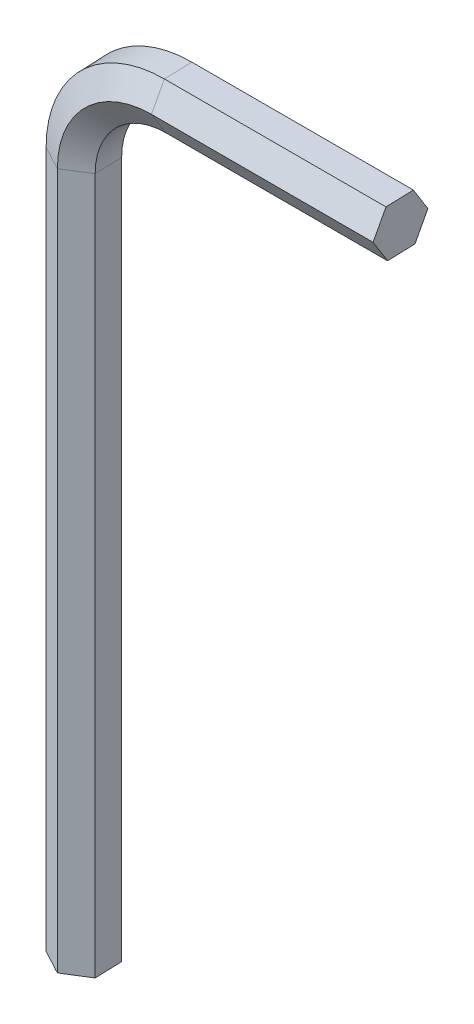
ISO-10303-21;
HEADER;
FILE_DESCRIPTION(('STEP AP214'),'2;1');
FILE_NAME('part.step','',(''),(''),'','','');
FILE_SCHEMA(('AUTOMOTIVE_DESIGN { 1 0 10303 214 1 1 1 1 }'));
ENDSEC;
DATA;
#1=APPLICATION_CONTEXT('core data for automotive mechanical design processes');
#2=APPLICATION_PROTOCOL_DEFINITION('international standard','automotive_design',2000,#1);
#3=PRODUCT_CONTEXT('',#1,'mechanical');
#4=PRODUCT('Part','Part','',(#3));
#5=PRODUCT_RELATED_PRODUCT_CATEGORY('part','',(#4));
#6=PRODUCT_DEFINITION_FORMATION('','',#4);
#7=PRODUCT_DEFINITION_CONTEXT('part definition',#1,'design');
#8=PRODUCT_DEFINITION('design','',#6,#7);
#9=PRODUCT_DEFINITION_SHAPE('','',#8);
#10=(LENGTH_UNIT() NAMED_UNIT(*) SI_UNIT(.MILLI.,.METRE.));
#11=(NAMED_UNIT(*) PLANE_ANGLE_UNIT() SI_UNIT($,.RADIAN.));
#12=(NAMED_UNIT(*) SI_UNIT($,.STERADIAN.) SOLID_ANGLE_UNIT());
#13=UNCERTAINTY_MEASURE_WITH_UNIT(LENGTH_MEASURE(1.E-05),#10,'distance_accuracy_value','');
#14=(GEOMETRIC_REPRESENTATION_CONTEXT(3) GLOBAL_UNCERTAINTY_ASSIGNED_CONTEXT((#13)) GLOBAL_UNIT_ASSIGNED_CONTEXT((#10,
#11,#12)) REPRESENTATION_CONTEXT('',''));
#15=CARTESIAN_POINT('',(0.,0.,0.));
#16=DIRECTION('',(0.,0.,1.));
#17=DIRECTION('',(1.,0.,0.));
#18=AXIS2_PLACEMENT_3D('',#15,#16,#17);
#19=CARTESIAN_POINT('',(0.,0.,0.));
#20=DIRECTION('',(0.,1.,0.));
#21=DIRECTION('',(0.,0.,1.));
#22=AXIS2_PLACEMENT_3D('',#19,#20,#21);
#23=PLANE('',#22);
#24=DIRECTION('',(-0.0329884243082686,0.,-0.99945573381799));
#25=VECTOR('',#24,1.);
#26=CARTESIAN_POINT('',(1.94024556604513,0.,1.03641070210713));
#27=LINE('',#26,#25);
#28=CARTESIAN_POINT('',(1.94024556604513,0.,1.03641070210713));
#29=VERTEX_POINT('',#28);
#30=CARTESIAN_POINT('',(1.86768077980141,0.,-1.16209659872164));
#31=VERTEX_POINT('',#30);
#32=EDGE_CURVE('E188',#29,#31,#27,.T.);
#33=ORIENTED_EDGE('',*,*,#32,.F.);
#34=DIRECTION('',(0.849059843290263,0.,-0.528296680390776));
#35=VECTOR('',#34,1.);
#36=CARTESIAN_POINT('',(0.0725647862437208,0.,2.19850730082877));
#37=LINE('',#36,#35);
#38=CARTESIAN_POINT('',(0.0725647862437208,0.,2.19850730082877));
#39=VERTEX_POINT('',#38);
#40=EDGE_CURVE('E230',#39,#29,#37,.T.);
#41=ORIENTED_EDGE('',*,*,#40,.F.);
#42=DIRECTION('',(0.882048267598532,0.,0.471159053427215));
#43=VECTOR('',#42,1.);
#44=CARTESIAN_POINT('',(-1.86768077980141,0.,1.16209659872164));
#45=LINE('',#44,#43);
#46=CARTESIAN_POINT('',(-1.86768077980141,0.,1.16209659872164));
#47=VERTEX_POINT('',#46);
#48=EDGE_CURVE('E217',#47,#39,#45,.T.);
#49=ORIENTED_EDGE('',*,*,#48,.F.);
#50=DIRECTION('',(0.0329884243082689,0.,0.99945573381799));
#51=VECTOR('',#50,1.);
#52=CARTESIAN_POINT('',(-1.94024556604513,0.,-1.03641070210713));
#53=LINE('',#52,#51);
#54=CARTESIAN_POINT('',(-1.94024556604513,0.,-1.03641070210713));
#55=VERTEX_POINT('',#54);
#56=EDGE_CURVE('E140',#55,#47,#53,.T.);
#57=ORIENTED_EDGE('',*,*,#56,.F.);
#58=DIRECTION('',(-0.849059843290263,0.,0.528296680390776));
#59=VECTOR('',#58,1.);
#60=CARTESIAN_POINT('',(-0.0725647862437226,0.,-2.19850730082877));
#61=LINE('',#60,#59);
#62=CARTESIAN_POINT('',(-0.0725647862437226,0.,-2.19850730082877));
#63=VERTEX_POINT('',#62);
#64=EDGE_CURVE('E144',#63,#55,#61,.T.);
#65=ORIENTED_EDGE('',*,*,#64,.F.);
#66=DIRECTION('',(-0.882048267598532,0.,-0.471159053427215));
#67=VECTOR('',#66,1.);
#68=CARTESIAN_POINT('',(1.86768077980141,0.,-1.16209659872164));
#69=LINE('',#68,#67);
#70=EDGE_CURVE('E149',#31,#63,#69,.T.);
#71=ORIENTED_EDGE('',*,*,#70,.F.);
#72=EDGE_LOOP('',(#33,#41,#49,#57,#65,#71));
#73=FACE_BOUND('',#72,.T.);
#74=ADVANCED_FACE('F39',(#73),#23,.F.);
#75=CARTESIAN_POINT('',(25.4,63.5,0.));
#76=DIRECTION('',(1.,0.,0.));
#77=DIRECTION('',(0.,0.,1.));
#78=AXIS2_PLACEMENT_3D('',#75,#76,#77);
#79=PLANE('',#78);
#80=DIRECTION('',(0.,0.0329884243082686,-0.99945573381799));
#81=VECTOR('',#80,1.);
#82=CARTESIAN_POINT('',(25.4,61.5597544339549,1.03641070210713));
#83=LINE('',#82,#81);
#84=CARTESIAN_POINT('',(25.4,61.5597544339549,1.03641070210713));
#85=VERTEX_POINT('',#84);
#86=CARTESIAN_POINT('',(25.4,61.6323192201986,-1.16209659872164));
#87=VERTEX_POINT('',#86);
#88=EDGE_CURVE('E160',#85,#87,#83,.T.);
#89=ORIENTED_EDGE('',*,*,#88,.T.);
#90=DIRECTION('',(0.,0.882048267598532,-0.471159053427215));
#91=VECTOR('',#90,1.);
#92=CARTESIAN_POINT('',(25.4,61.6323192201986,-1.16209659872164));
#93=LINE('',#92,#91);
#94=CARTESIAN_POINT('',(25.4,63.5725647862437,-2.19850730082877));
#95=VERTEX_POINT('',#94);
#96=EDGE_CURVE('E163',#87,#95,#93,.T.);
#97=ORIENTED_EDGE('',*,*,#96,.T.);
#98=DIRECTION('',(0.,0.849059843290263,0.528296680390776));
#99=VECTOR('',#98,1.);
#100=CARTESIAN_POINT('',(25.4,63.5725647862437,-2.19850730082877));
#101=LINE('',#100,#99);
#102=CARTESIAN_POINT('',(25.4,65.4402455660451,-1.03641070210713));
#103=VERTEX_POINT('',#102);
#104=EDGE_CURVE('E203',#95,#103,#101,.T.);
#105=ORIENTED_EDGE('',*,*,#104,.T.);
#106=DIRECTION('',(0.,-0.0329884243082689,0.99945573381799));
#107=VECTOR('',#106,1.);
#108=CARTESIAN_POINT('',(25.4,65.4402455660451,-1.03641070210713));
#109=LINE('',#108,#107);
#110=CARTESIAN_POINT('',(25.4,65.3676807798014,1.16209659872164));
#111=VERTEX_POINT('',#110);
#112=EDGE_CURVE('E58',#103,#111,#109,.T.);
#113=ORIENTED_EDGE('',*,*,#112,.T.);
#114=DIRECTION('',(0.,-0.882048267598532,0.471159053427215));
#115=VECTOR('',#114,1.);
#116=CARTESIAN_POINT('',(25.4,65.3676807798014,1.16209659872164));
#117=LINE('',#116,#115);
#118=CARTESIAN_POINT('',(25.4,63.4274352137563,2.19850730082877));
#119=VERTEX_POINT('',#118);
#120=EDGE_CURVE('E52',#111,#119,#117,.T.);
#121=ORIENTED_EDGE('',*,*,#120,.T.);
#122=DIRECTION('',(0.,-0.849059843290263,-0.528296680390776));
#123=VECTOR('',#122,1.);
#124=CARTESIAN_POINT('',(25.4,63.4274352137563,2.19850730082877));
#125=LINE('',#124,#123);
#126=EDGE_CURVE('E11',#119,#85,#125,.T.);
#127=ORIENTED_EDGE('',*,*,#126,.T.);
#128=EDGE_LOOP('',(#89,#97,#105,#113,#121,#127));
#129=FACE_BOUND('',#128,.T.);
#130=ADVANCED_FACE('F162',(#129),#79,.T.);
#131=CARTESIAN_POINT('',(1.94024556604513,0.,1.03641070210713));
#132=DIRECTION('',(0.99945573381799,0.,-0.0329884243082686));
#133=DIRECTION('',(-0.0329884243082686,0.,-0.99945573381799));
#134=AXIS2_PLACEMENT_3D('',#131,#132,#133);
#135=PLANE('',#134);
#136=DIRECTION('',(0.,1.,0.));
#137=VECTOR('',#136,1.);
#138=CARTESIAN_POINT('',(1.86768077980141,0.,-1.16209659872164));
#139=LINE('',#138,#137);
#140=CARTESIAN_POINT('',(1.86768077980141,55.88,-1.16209659872164));
#141=VERTEX_POINT('',#140);
#142=EDGE_CURVE('E193',#31,#141,#139,.T.);
#143=ORIENTED_EDGE('',*,*,#142,.T.);
#144=DIRECTION('',(-0.0329884243082686,0.,-0.99945573381799));
#145=VECTOR('',#144,1.);
#146=CARTESIAN_POINT('',(1.94024556604513,55.88,1.03641070210713));
#147=LINE('',#146,#145);
#148=CARTESIAN_POINT('',(1.94024556604513,55.88,1.03641070210713));
#149=VERTEX_POINT('',#148);
#150=EDGE_CURVE('E262',#149,#141,#147,.T.);
#151=ORIENTED_EDGE('',*,*,#150,.F.);
#152=DIRECTION('',(0.,1.,0.));
#153=VECTOR('',#152,1.);
#154=CARTESIAN_POINT('',(1.94024556604513,0.,1.03641070210713));
#155=LINE('',#154,#153);
#156=EDGE_CURVE('E244',#29,#149,#155,.T.);
#157=ORIENTED_EDGE('',*,*,#156,.F.);
#158=ORIENTED_EDGE('',*,*,#32,.T.);
#159=EDGE_LOOP('',(#143,#151,#157,#158));
#160=FACE_BOUND('',#159,.T.);
#161=ADVANCED_FACE('F269',(#160),#135,.T.);
#162=CARTESIAN_POINT('',(1.86768077980141,0.,-1.16209659872164));
#163=DIRECTION('',(0.471159053427215,0.,-0.882048267598532));
#164=DIRECTION('',(-0.882048267598532,0.,-0.471159053427215));
#165=AXIS2_PLACEMENT_3D('',#162,#163,#164);
#166=PLANE('',#165);
#167=DIRECTION('',(0.,1.,0.));
#168=VECTOR('',#167,1.);
#169=CARTESIAN_POINT('',(-0.0725647862437226,0.,-2.19850730082877));
#170=LINE('',#169,#168);
#171=CARTESIAN_POINT('',(-0.0725647862437226,55.88,-2.19850730082877));
#172=VERTEX_POINT('',#171);
#173=EDGE_CURVE('E192',#63,#172,#170,.T.);
#174=ORIENTED_EDGE('',*,*,#173,.T.);
#175=DIRECTION('',(-0.882048267598532,0.,-0.471159053427215));
#176=VECTOR('',#175,1.);
#177=CARTESIAN_POINT('',(1.86768077980141,55.88,-1.16209659872164));
#178=LINE('',#177,#176);
#179=EDGE_CURVE('E189',#141,#172,#178,.T.);
#180=ORIENTED_EDGE('',*,*,#179,.F.);
#181=ORIENTED_EDGE('',*,*,#142,.F.);
#182=ORIENTED_EDGE('',*,*,#70,.T.);
#183=EDGE_LOOP('',(#174,#180,#181,#182));
#184=FACE_BOUND('',#183,.T.);
#185=ADVANCED_FACE('F272',(#184),#166,.T.);
#186=CARTESIAN_POINT('',(-0.0725647862437226,0.,-2.19850730082877));
#187=DIRECTION('',(-0.528296680390776,0.,-0.849059843290263));
#188=DIRECTION('',(-0.849059843290263,0.,0.528296680390776));
#189=AXIS2_PLACEMENT_3D('',#186,#187,#188);
#190=PLANE('',#189);
#191=DIRECTION('',(0.,1.,0.));
#192=VECTOR('',#191,1.);
#193=CARTESIAN_POINT('',(-1.94024556604513,0.,-1.03641070210713));
#194=LINE('',#193,#192);
#195=CARTESIAN_POINT('',(-1.94024556604513,55.88,-1.03641070210713));
#196=VERTEX_POINT('',#195);
#197=EDGE_CURVE('E206',#55,#196,#194,.T.);
#198=ORIENTED_EDGE('',*,*,#197,.T.);
#199=DIRECTION('',(-0.849059843290263,0.,0.528296680390776));
#200=VECTOR('',#199,1.);
#201=CARTESIAN_POINT('',(-0.0725647862437226,55.88,-2.19850730082877));
#202=LINE('',#201,#200);
#203=EDGE_CURVE('E196',#172,#196,#202,.T.);
#204=ORIENTED_EDGE('',*,*,#203,.F.);
#205=ORIENTED_EDGE('',*,*,#173,.F.);
#206=ORIENTED_EDGE('',*,*,#64,.T.);
#207=EDGE_LOOP('',(#198,#204,#205,#206));
#208=FACE_BOUND('',#207,.T.);
#209=ADVANCED_FACE('F327',(#208),#190,.T.);
#210=CARTESIAN_POINT('',(-1.94024556604513,0.,-1.03641070210713));
#211=DIRECTION('',(-0.99945573381799,0.,0.0329884243082689));
#212=DIRECTION('',(0.0329884243082689,0.,0.99945573381799));
#213=AXIS2_PLACEMENT_3D('',#210,#211,#212);
#214=PLANE('',#213);
#215=DIRECTION('',(0.,1.,0.));
#216=VECTOR('',#215,1.);
#217=CARTESIAN_POINT('',(-1.86768077980141,0.,1.16209659872164));
#218=LINE('',#217,#216);
#219=CARTESIAN_POINT('',(-1.86768077980141,55.88,1.16209659872164));
#220=VERTEX_POINT('',#219);
#221=EDGE_CURVE('E219',#47,#220,#218,.T.);
#222=ORIENTED_EDGE('',*,*,#221,.T.);
#223=DIRECTION('',(0.0329884243082689,0.,0.99945573381799));
#224=VECTOR('',#223,1.);
#225=CARTESIAN_POINT('',(-1.94024556604513,55.88,-1.03641070210713));
#226=LINE('',#225,#224);
#227=EDGE_CURVE('E209',#196,#220,#226,.T.);
#228=ORIENTED_EDGE('',*,*,#227,.F.);
#229=ORIENTED_EDGE('',*,*,#197,.F.);
#230=ORIENTED_EDGE('',*,*,#56,.T.);
#231=EDGE_LOOP('',(#222,#228,#229,#230));
#232=FACE_BOUND('',#231,.T.);
#233=ADVANCED_FACE('F335',(#232),#214,.T.);
#234=CARTESIAN_POINT('',(-1.86768077980141,0.,1.16209659872164));
#235=DIRECTION('',(-0.471159053427215,0.,0.882048267598532));
#236=DIRECTION('',(0.882048267598532,0.,0.471159053427215));
#237=AXIS2_PLACEMENT_3D('',#234,#235,#236);
#238=PLANE('',#237);
#239=DIRECTION('',(0.,1.,0.));
#240=VECTOR('',#239,1.);
#241=CARTESIAN_POINT('',(0.0725647862437208,0.,2.19850730082877));
#242=LINE('',#241,#240);
#243=CARTESIAN_POINT('',(0.0725647862437208,55.88,2.19850730082877));
#244=VERTEX_POINT('',#243);
#245=EDGE_CURVE('E232',#39,#244,#242,.T.);
#246=ORIENTED_EDGE('',*,*,#245,.T.);
#247=DIRECTION('',(0.882048267598532,0.,0.471159053427215));
#248=VECTOR('',#247,1.);
#249=CARTESIAN_POINT('',(-1.86768077980141,55.88,1.16209659872164));
#250=LINE('',#249,#248);
#251=EDGE_CURVE('E222',#220,#244,#250,.T.);
#252=ORIENTED_EDGE('',*,*,#251,.F.);
#253=ORIENTED_EDGE('',*,*,#221,.F.);
#254=ORIENTED_EDGE('',*,*,#48,.T.);
#255=EDGE_LOOP('',(#246,#252,#253,#254));
#256=FACE_BOUND('',#255,.T.);
#257=ADVANCED_FACE('F345',(#256),#238,.T.);
#258=CARTESIAN_POINT('',(0.0725647862437208,0.,2.19850730082877));
#259=DIRECTION('',(0.528296680390776,0.,0.849059843290263));
#260=DIRECTION('',(0.849059843290263,0.,-0.528296680390776));
#261=AXIS2_PLACEMENT_3D('',#258,#259,#260);
#262=PLANE('',#261);
#263=DIRECTION('',(0.849059843290263,0.,-0.528296680390776));
#264=VECTOR('',#263,1.);
#265=CARTESIAN_POINT('',(0.0725647862437208,55.88,2.19850730082877));
#266=LINE('',#265,#264);
#267=EDGE_CURVE('E235',#244,#149,#266,.T.);
#268=ORIENTED_EDGE('',*,*,#267,.F.);
#269=ORIENTED_EDGE('',*,*,#245,.F.);
#270=ORIENTED_EDGE('',*,*,#40,.T.);
#271=ORIENTED_EDGE('',*,*,#156,.T.);
#272=EDGE_LOOP('',(#268,#269,#270,#271));
#273=FACE_BOUND('',#272,.T.);
#274=ADVANCED_FACE('F285',(#273),#262,.T.);
#275=CARTESIAN_POINT('',(7.62,55.88,1.03641070210713));
#276=DIRECTION('',(0.,0.,-1.));
#277=DIRECTION('',(-1.,0.,0.));
#278=AXIS2_PLACEMENT_3D('',#275,#276,#277);
#279=CONICAL_SURFACE('',#278,5.67975443395486,0.0329944104394245);
#280=CARTESIAN_POINT('',(7.62,55.88,-1.16209659872164));
#281=DIRECTION('',(0.,0.,-1.));
#282=DIRECTION('',(-1.,0.,0.));
#283=AXIS2_PLACEMENT_3D('',#280,#281,#282);
#284=CIRCLE('',#283,5.75231922019859);
#285=CARTESIAN_POINT('',(7.62000000000004,61.6323192201986,-1.16209659872164));
#286=VERTEX_POINT('',#285);
#287=EDGE_CURVE('E199',#141,#286,#284,.T.);
#288=ORIENTED_EDGE('',*,*,#287,.T.);
#289=DIRECTION('',(0.,0.0329884243082686,-0.99945573381799));
#290=VECTOR('',#289,1.);
#291=CARTESIAN_POINT('',(7.62000000000004,61.5597544339549,1.03641070210713));
#292=LINE('',#291,#290);
#293=CARTESIAN_POINT('',(7.62000000000004,61.5597544339549,1.03641070210713));
#294=VERTEX_POINT('',#293);
#295=EDGE_CURVE('E181',#294,#286,#292,.T.);
#296=ORIENTED_EDGE('',*,*,#295,.F.);
#297=CARTESIAN_POINT('',(7.62,55.88,1.03641070210713));
#298=DIRECTION('',(0.,0.,-1.));
#299=DIRECTION('',(-1.,0.,0.));
#300=AXIS2_PLACEMENT_3D('',#297,#298,#299);
#301=CIRCLE('',#300,5.67975443395486);
#302=EDGE_CURVE('E246',#149,#294,#301,.T.);
#303=ORIENTED_EDGE('',*,*,#302,.F.);
#304=ORIENTED_EDGE('',*,*,#150,.T.);
#305=EDGE_LOOP('',(#288,#296,#303,#304));
#306=FACE_BOUND('',#305,.T.);
#307=ADVANCED_FACE('F252',(#306),#279,.F.);
#308=CARTESIAN_POINT('',(7.62,55.88,-1.16209659872164));
#309=DIRECTION('',(0.,0.,-1.));
#310=DIRECTION('',(-1.,0.,0.));
#311=AXIS2_PLACEMENT_3D('',#308,#309,#310);
#312=CONICAL_SURFACE('',#311,5.75231922019859,1.08019196163602);
#313=CARTESIAN_POINT('',(7.62,55.88,-2.19850730082877));
#314=DIRECTION('',(0.,0.,-1.));
#315=DIRECTION('',(-1.,0.,0.));
#316=AXIS2_PLACEMENT_3D('',#313,#314,#315);
#317=CIRCLE('',#316,7.69256478624372);
#318=CARTESIAN_POINT('',(7.62000000000005,63.5725647862437,-2.19850730082877));
#319=VERTEX_POINT('',#318);
#320=EDGE_CURVE('E127',#172,#319,#317,.T.);
#321=ORIENTED_EDGE('',*,*,#320,.T.);
#322=DIRECTION('',(0.,0.882048267598532,-0.471159053427215));
#323=VECTOR('',#322,1.);
#324=CARTESIAN_POINT('',(7.62000000000004,61.6323192201986,-1.16209659872164));
#325=LINE('',#324,#323);
#326=EDGE_CURVE('E197',#286,#319,#325,.T.);
#327=ORIENTED_EDGE('',*,*,#326,.F.);
#328=ORIENTED_EDGE('',*,*,#287,.F.);
#329=ORIENTED_EDGE('',*,*,#179,.T.);
#330=EDGE_LOOP('',(#321,#327,#328,#329));
#331=FACE_BOUND('',#330,.T.);
#332=ADVANCED_FACE('F275',(#331),#312,.F.);
#333=CARTESIAN_POINT('',(7.62,55.88,-2.19850730082877));
#334=DIRECTION('',(0.,0.,1.));
#335=DIRECTION('',(1.,0.,0.));
#336=AXIS2_PLACEMENT_3D('',#333,#334,#335);
#337=CONICAL_SURFACE('',#336,7.69256478624372,1.01420314075717);
#338=CARTESIAN_POINT('',(7.62,55.88,-1.03641070210713));
#339=DIRECTION('',(0.,0.,-1.));
#340=DIRECTION('',(-1.,0.,0.));
#341=AXIS2_PLACEMENT_3D('',#338,#339,#340);
#342=CIRCLE('',#341,9.56024556604513);
#343=CARTESIAN_POINT('',(7.62000000000006,65.4402455660451,-1.03641070210713));
#344=VERTEX_POINT('',#343);
#345=EDGE_CURVE('E118',#196,#344,#342,.T.);
#346=ORIENTED_EDGE('',*,*,#345,.T.);
#347=DIRECTION('',(0.,0.849059843290263,0.528296680390776));
#348=VECTOR('',#347,1.);
#349=CARTESIAN_POINT('',(7.62000000000005,63.5725647862437,-2.19850730082877));
#350=LINE('',#349,#348);
#351=EDGE_CURVE('E200',#319,#344,#350,.T.);
#352=ORIENTED_EDGE('',*,*,#351,.F.);
#353=ORIENTED_EDGE('',*,*,#320,.F.);
#354=ORIENTED_EDGE('',*,*,#203,.T.);
#355=EDGE_LOOP('',(#346,#352,#353,#354));
#356=FACE_BOUND('',#355,.T.);
#357=ADVANCED_FACE('F277',(#356),#337,.T.);
#358=CARTESIAN_POINT('',(7.62,55.88,-1.03641070210713));
#359=DIRECTION('',(0.,0.,-1.));
#360=DIRECTION('',(-1.,0.,0.));
#361=AXIS2_PLACEMENT_3D('',#358,#359,#360);
#362=CONICAL_SURFACE('',#361,9.56024556604513,0.0329944104394249);
#363=CARTESIAN_POINT('',(7.62,55.88,1.16209659872164));
#364=DIRECTION('',(0.,0.,-1.));
#365=DIRECTION('',(-1.,0.,0.));
#366=AXIS2_PLACEMENT_3D('',#363,#364,#365);
#367=CIRCLE('',#366,9.48768077980141);
#368=CARTESIAN_POINT('',(7.62000000000006,65.3676807798014,1.16209659872164));
#369=VERTEX_POINT('',#368);
#370=EDGE_CURVE('E111',#220,#369,#367,.T.);
#371=ORIENTED_EDGE('',*,*,#370,.T.);
#372=DIRECTION('',(0.,-0.0329884243082689,0.99945573381799));
#373=VECTOR('',#372,1.);
#374=CARTESIAN_POINT('',(7.62000000000006,65.4402455660451,-1.03641070210713));
#375=LINE('',#374,#373);
#376=EDGE_CURVE('E213',#344,#369,#375,.T.);
#377=ORIENTED_EDGE('',*,*,#376,.F.);
#378=ORIENTED_EDGE('',*,*,#345,.F.);
#379=ORIENTED_EDGE('',*,*,#227,.T.);
#380=EDGE_LOOP('',(#371,#377,#378,#379));
#381=FACE_BOUND('',#380,.T.);
#382=ADVANCED_FACE('F283',(#381),#362,.T.);
#383=CARTESIAN_POINT('',(7.62,55.88,1.16209659872164));
#384=DIRECTION('',(0.,0.,-1.));
#385=DIRECTION('',(-1.,0.,0.));
#386=AXIS2_PLACEMENT_3D('',#383,#384,#385);
#387=CONICAL_SURFACE('',#386,9.48768077980141,1.08019196163602);
#388=CARTESIAN_POINT('',(7.62,55.88,2.19850730082877));
#389=DIRECTION('',(0.,0.,-1.));
#390=DIRECTION('',(-1.,0.,0.));
#391=AXIS2_PLACEMENT_3D('',#388,#389,#390);
#392=CIRCLE('',#391,7.54743521375628);
#393=CARTESIAN_POINT('',(7.62000000000005,63.4274352137563,2.19850730082877));
#394=VERTEX_POINT('',#393);
#395=EDGE_CURVE('E237',#244,#394,#392,.T.);
#396=ORIENTED_EDGE('',*,*,#395,.T.);
#397=DIRECTION('',(0.,-0.882048267598532,0.471159053427215));
#398=VECTOR('',#397,1.);
#399=CARTESIAN_POINT('',(7.62000000000006,65.3676807798014,1.16209659872164));
#400=LINE('',#399,#398);
#401=EDGE_CURVE('E225',#369,#394,#400,.T.);
#402=ORIENTED_EDGE('',*,*,#401,.F.);
#403=ORIENTED_EDGE('',*,*,#370,.F.);
#404=ORIENTED_EDGE('',*,*,#251,.T.);
#405=EDGE_LOOP('',(#396,#402,#403,#404));
#406=FACE_BOUND('',#405,.T.);
#407=ADVANCED_FACE('F388',(#406),#387,.T.);
#408=CARTESIAN_POINT('',(7.62,55.88,2.19850730082877));
#409=DIRECTION('',(0.,0.,1.));
#410=DIRECTION('',(1.,0.,0.));
#411=AXIS2_PLACEMENT_3D('',#408,#409,#410);
#412=CONICAL_SURFACE('',#411,7.54743521375628,1.01420314075717);
#413=DIRECTION('',(0.,-0.849059843290263,-0.528296680390776));
#414=VECTOR('',#413,1.);
#415=CARTESIAN_POINT('',(7.62000000000005,63.4274352137563,2.19850730082877));
#416=LINE('',#415,#414);
#417=EDGE_CURVE('E186',#394,#294,#416,.T.);
#418=ORIENTED_EDGE('',*,*,#417,.F.);
#419=ORIENTED_EDGE('',*,*,#395,.F.);
#420=ORIENTED_EDGE('',*,*,#267,.T.);
#421=ORIENTED_EDGE('',*,*,#302,.T.);
#422=EDGE_LOOP('',(#418,#419,#420,#421));
#423=FACE_BOUND('',#422,.T.);
#424=ADVANCED_FACE('F255',(#423),#412,.F.);
#425=CARTESIAN_POINT('',(7.62000000000005,61.5597544339549,1.03641070210713));
#426=DIRECTION('',(0.,-0.99945573381799,-0.0329884243082686));
#427=DIRECTION('',(0.,0.0329884243082686,-0.99945573381799));
#428=AXIS2_PLACEMENT_3D('',#425,#426,#427);
#429=PLANE('',#428);
#430=DIRECTION('',(1.,0.,0.));
#431=VECTOR('',#430,1.);
#432=CARTESIAN_POINT('',(7.62000000000005,61.6323192201986,-1.16209659872164));
#433=LINE('',#432,#431);
#434=EDGE_CURVE('E168',#286,#87,#433,.T.);
#435=ORIENTED_EDGE('',*,*,#434,.T.);
#436=ORIENTED_EDGE('',*,*,#88,.F.);
#437=DIRECTION('',(1.,0.,0.));
#438=VECTOR('',#437,1.);
#439=CARTESIAN_POINT('',(7.62000000000005,61.5597544339549,1.03641070210713));
#440=LINE('',#439,#438);
#441=EDGE_CURVE('E169',#294,#85,#440,.T.);
#442=ORIENTED_EDGE('',*,*,#441,.F.);
#443=ORIENTED_EDGE('',*,*,#295,.T.);
#444=EDGE_LOOP('',(#435,#436,#442,#443));
#445=FACE_BOUND('',#444,.T.);
#446=ADVANCED_FACE('F179',(#445),#429,.T.);
#447=CARTESIAN_POINT('',(7.62000000000005,61.6323192201986,-1.16209659872164));
#448=DIRECTION('',(0.,-0.471159053427215,-0.882048267598532));
#449=DIRECTION('',(0.,0.882048267598532,-0.471159053427215));
#450=AXIS2_PLACEMENT_3D('',#447,#448,#449);
#451=PLANE('',#450);
#452=DIRECTION('',(1.,0.,0.));
#453=VECTOR('',#452,1.);
#454=CARTESIAN_POINT('',(7.62000000000005,63.5725647862437,-2.19850730082877));
#455=LINE('',#454,#453);
#456=EDGE_CURVE('E176',#319,#95,#455,.T.);
#457=ORIENTED_EDGE('',*,*,#456,.T.);
#458=ORIENTED_EDGE('',*,*,#96,.F.);
#459=ORIENTED_EDGE('',*,*,#434,.F.);
#460=ORIENTED_EDGE('',*,*,#326,.T.);
#461=EDGE_LOOP('',(#457,#458,#459,#460));
#462=FACE_BOUND('',#461,.T.);
#463=ADVANCED_FACE('F173',(#462),#451,.T.);
#464=CARTESIAN_POINT('',(7.62000000000005,63.5725647862437,-2.19850730082877));
#465=DIRECTION('',(0.,0.528296680390776,-0.849059843290263));
#466=DIRECTION('',(0.,0.849059843290263,0.528296680390776));
#467=AXIS2_PLACEMENT_3D('',#464,#465,#466);
#468=PLANE('',#467);
#469=DIRECTION('',(1.,0.,0.));
#470=VECTOR('',#469,1.);
#471=CARTESIAN_POINT('',(7.62000000000005,65.4402455660451,-1.03641070210713));
#472=LINE('',#471,#470);
#473=EDGE_CURVE('E96',#344,#103,#472,.T.);
#474=ORIENTED_EDGE('',*,*,#473,.T.);
#475=ORIENTED_EDGE('',*,*,#104,.F.);
#476=ORIENTED_EDGE('',*,*,#456,.F.);
#477=ORIENTED_EDGE('',*,*,#351,.T.);
#478=EDGE_LOOP('',(#474,#475,#476,#477));
#479=FACE_BOUND('',#478,.T.);
#480=ADVANCED_FACE('F420',(#479),#468,.T.);
#481=CARTESIAN_POINT('',(7.62000000000005,65.4402455660451,-1.03641070210713));
#482=DIRECTION('',(0.,0.99945573381799,0.0329884243082689));
#483=DIRECTION('',(0.,-0.0329884243082689,0.99945573381799));
#484=AXIS2_PLACEMENT_3D('',#481,#482,#483);
#485=PLANE('',#484);
#486=DIRECTION('',(1.,0.,0.));
#487=VECTOR('',#486,1.);
#488=CARTESIAN_POINT('',(7.62000000000005,65.3676807798014,1.16209659872164));
#489=LINE('',#488,#487);
#490=EDGE_CURVE('E88',#369,#111,#489,.T.);
#491=ORIENTED_EDGE('',*,*,#490,.T.);
#492=ORIENTED_EDGE('',*,*,#112,.F.);
#493=ORIENTED_EDGE('',*,*,#473,.F.);
#494=ORIENTED_EDGE('',*,*,#376,.T.);
#495=EDGE_LOOP('',(#491,#492,#493,#494));
#496=FACE_BOUND('',#495,.T.);
#497=ADVANCED_FACE('F295',(#496),#485,.T.);
#498=CARTESIAN_POINT('',(7.62000000000005,65.3676807798014,1.16209659872164));
#499=DIRECTION('',(0.,0.471159053427215,0.882048267598532));
#500=DIRECTION('',(0.,-0.882048267598532,0.471159053427215));
#501=AXIS2_PLACEMENT_3D('',#498,#499,#500);
#502=PLANE('',#501);
#503=DIRECTION('',(1.,0.,0.));
#504=VECTOR('',#503,1.);
#505=CARTESIAN_POINT('',(7.62000000000005,63.4274352137563,2.19850730082877));
#506=LINE('',#505,#504);
#507=EDGE_CURVE('E46',#394,#119,#506,.T.);
#508=ORIENTED_EDGE('',*,*,#507,.T.);
#509=ORIENTED_EDGE('',*,*,#120,.F.);
#510=ORIENTED_EDGE('',*,*,#490,.F.);
#511=ORIENTED_EDGE('',*,*,#401,.T.);
#512=EDGE_LOOP('',(#508,#509,#510,#511));
#513=FACE_BOUND('',#512,.T.);
#514=ADVANCED_FACE('F290',(#513),#502,.T.);
#515=CARTESIAN_POINT('',(7.62000000000005,63.4274352137563,2.19850730082877));
#516=DIRECTION('',(0.,-0.528296680390776,0.849059843290264));
#517=DIRECTION('',(0.,-0.849059843290263,-0.528296680390776));
#518=AXIS2_PLACEMENT_3D('',#515,#516,#517);
#519=PLANE('',#518);
#520=ORIENTED_EDGE('',*,*,#126,.F.);
#521=ORIENTED_EDGE('',*,*,#507,.F.);
#522=ORIENTED_EDGE('',*,*,#417,.T.);
#523=ORIENTED_EDGE('',*,*,#441,.T.);
#524=EDGE_LOOP('',(#520,#521,#522,#523));
#525=FACE_BOUND('',#524,.T.);
#526=ADVANCED_FACE('F247',(#525),#519,.T.);
#527=CLOSED_SHELL('',(#74,#130,#161,#185,#209,#233,#257,#274,#307,#332,#357,#382,#407,#424,#446,
#463,#480,#497,#514,#526));
#528=MANIFOLD_SOLID_BREP('B2',#527);
#529=ADVANCED_BREP_SHAPE_REPRESENTATION('',(#18,#528),#14);
#530=SHAPE_DEFINITION_REPRESENTATION(#9,#529);
ENDSEC;
END-ISO-10303-21;
